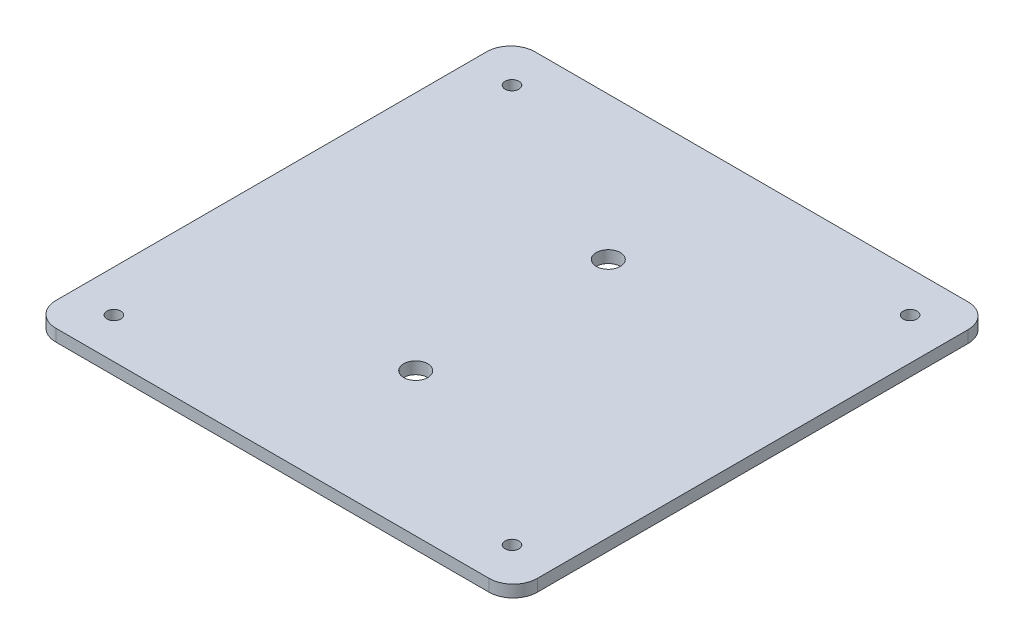
ISO-10303-21;
HEADER;
FILE_DESCRIPTION(('STEP AP214'),'2;1');
FILE_NAME('part.step','',(''),(''),'','','');
FILE_SCHEMA(('AUTOMOTIVE_DESIGN { 1 0 10303 214 1 1 1 1 }'));
ENDSEC;
DATA;
#1=APPLICATION_CONTEXT('core data for automotive mechanical design processes');
#2=APPLICATION_PROTOCOL_DEFINITION('international standard','automotive_design',2000,#1);
#3=PRODUCT_CONTEXT('',#1,'mechanical');
#4=PRODUCT('Part','Part','',(#3));
#5=PRODUCT_RELATED_PRODUCT_CATEGORY('part','',(#4));
#6=PRODUCT_DEFINITION_FORMATION('','',#4);
#7=PRODUCT_DEFINITION_CONTEXT('part definition',#1,'design');
#8=PRODUCT_DEFINITION('design','',#6,#7);
#9=PRODUCT_DEFINITION_SHAPE('','',#8);
#10=(LENGTH_UNIT() NAMED_UNIT(*) SI_UNIT(.MILLI.,.METRE.));
#11=(NAMED_UNIT(*) PLANE_ANGLE_UNIT() SI_UNIT($,.RADIAN.));
#12=(NAMED_UNIT(*) SI_UNIT($,.STERADIAN.) SOLID_ANGLE_UNIT());
#13=UNCERTAINTY_MEASURE_WITH_UNIT(LENGTH_MEASURE(1.E-05),#10,'distance_accuracy_value','');
#14=(GEOMETRIC_REPRESENTATION_CONTEXT(3) GLOBAL_UNCERTAINTY_ASSIGNED_CONTEXT((#13)) GLOBAL_UNIT_ASSIGNED_CONTEXT((#10,
#11,#12)) REPRESENTATION_CONTEXT('',''));
#15=CARTESIAN_POINT('',(0.,0.,0.));
#16=DIRECTION('',(0.,0.,1.));
#17=DIRECTION('',(1.,0.,0.));
#18=AXIS2_PLACEMENT_3D('',#15,#16,#17);
#19=CARTESIAN_POINT('',(0.,3.175,0.));
#20=DIRECTION('',(0.,1.,0.));
#21=DIRECTION('',(0.,0.,1.));
#22=AXIS2_PLACEMENT_3D('',#19,#20,#21);
#23=PLANE('',#22);
#24=CARTESIAN_POINT('',(0.,3.175,-25.4));
#25=DIRECTION('',(0.,1.,0.));
#26=DIRECTION('',(0.,0.,1.));
#27=AXIS2_PLACEMENT_3D('',#24,#25,#26);
#28=CIRCLE('',#27,3.175);
#29=CARTESIAN_POINT('',(0.,3.175,-22.225));
#30=VERTEX_POINT('',#29);
#31=EDGE_CURVE('E237',#30,#30,#28,.T.);
#32=ORIENTED_EDGE('',*,*,#31,.F.);
#33=EDGE_LOOP('',(#32));
#34=FACE_BOUND('',#33,.T.);
#35=CARTESIAN_POINT('',(52.5145,3.175,52.5145));
#36=DIRECTION('',(0.,1.,0.));
#37=DIRECTION('',(0.,0.,1.));
#38=AXIS2_PLACEMENT_3D('',#35,#36,#37);
#39=CIRCLE('',#38,1.8288);
#40=CARTESIAN_POINT('',(52.5145,3.175,54.3433));
#41=VERTEX_POINT('',#40);
#42=EDGE_CURVE('E221',#41,#41,#39,.T.);
#43=ORIENTED_EDGE('',*,*,#42,.F.);
#44=EDGE_LOOP('',(#43));
#45=FACE_BOUND('',#44,.T.);
#46=CARTESIAN_POINT('',(-52.5145,3.175,-52.5145));
#47=DIRECTION('',(0.,1.,0.));
#48=DIRECTION('',(0.,0.,1.));
#49=AXIS2_PLACEMENT_3D('',#46,#47,#48);
#50=CIRCLE('',#49,1.8288);
#51=CARTESIAN_POINT('',(-52.5145,3.175,-50.6857));
#52=VERTEX_POINT('',#51);
#53=EDGE_CURVE('E208',#52,#52,#50,.T.);
#54=ORIENTED_EDGE('',*,*,#53,.F.);
#55=EDGE_LOOP('',(#54));
#56=FACE_BOUND('',#55,.T.);
#57=DIRECTION('',(-1.,0.,0.));
#58=VECTOR('',#57,1.);
#59=CARTESIAN_POINT('',(-63.5,3.175,-63.1798159793815));
#60=LINE('',#59,#58);
#61=CARTESIAN_POINT('',(57.15,3.175,-63.1798159793815));
#62=VERTEX_POINT('',#61);
#63=CARTESIAN_POINT('',(-57.15,3.175,-63.1798159793815));
#64=VERTEX_POINT('',#63);
#65=EDGE_CURVE('E195',#62,#64,#60,.T.);
#66=ORIENTED_EDGE('',*,*,#65,.T.);
#67=CARTESIAN_POINT('',(-57.15,3.175,-56.8298159793815));
#68=DIRECTION('',(0.,1.,0.));
#69=DIRECTION('',(0.,0.,1.));
#70=AXIS2_PLACEMENT_3D('',#67,#68,#69);
#71=CIRCLE('',#70,6.35);
#72=CARTESIAN_POINT('',(-63.5,3.175,-56.8298159793815));
#73=VERTEX_POINT('',#72);
#74=EDGE_CURVE('E168',#64,#73,#71,.T.);
#75=ORIENTED_EDGE('',*,*,#74,.T.);
#76=DIRECTION('',(0.,0.,1.));
#77=VECTOR('',#76,1.);
#78=CARTESIAN_POINT('',(-63.5,3.175,-63.1798159793815));
#79=LINE('',#78,#77);
#80=CARTESIAN_POINT('',(-63.5,3.175,56.8298159793815));
#81=VERTEX_POINT('',#80);
#82=EDGE_CURVE('E125',#73,#81,#79,.T.);
#83=ORIENTED_EDGE('',*,*,#82,.T.);
#84=CARTESIAN_POINT('',(-57.15,3.175,56.8298159793815));
#85=DIRECTION('',(0.,1.,0.));
#86=DIRECTION('',(0.,0.,1.));
#87=AXIS2_PLACEMENT_3D('',#84,#85,#86);
#88=CIRCLE('',#87,6.35);
#89=CARTESIAN_POINT('',(-57.15,3.175,63.1798159793815));
#90=VERTEX_POINT('',#89);
#91=EDGE_CURVE('E60',#81,#90,#88,.T.);
#92=ORIENTED_EDGE('',*,*,#91,.T.);
#93=DIRECTION('',(1.,0.,0.));
#94=VECTOR('',#93,1.);
#95=CARTESIAN_POINT('',(-63.5,3.175,63.1798159793815));
#96=LINE('',#95,#94);
#97=CARTESIAN_POINT('',(57.15,3.175,63.1798159793815));
#98=VERTEX_POINT('',#97);
#99=EDGE_CURVE('E146',#90,#98,#96,.T.);
#100=ORIENTED_EDGE('',*,*,#99,.T.);
#101=CARTESIAN_POINT('',(57.15,3.175,56.8298159793815));
#102=DIRECTION('',(0.,1.,0.));
#103=DIRECTION('',(0.,0.,1.));
#104=AXIS2_PLACEMENT_3D('',#101,#102,#103);
#105=CIRCLE('',#104,6.35);
#106=CARTESIAN_POINT('',(63.5,3.175,56.8298159793815));
#107=VERTEX_POINT('',#106);
#108=EDGE_CURVE('E162',#98,#107,#105,.T.);
#109=ORIENTED_EDGE('',*,*,#108,.T.);
#110=DIRECTION('',(0.,0.,-1.));
#111=VECTOR('',#110,1.);
#112=CARTESIAN_POINT('',(63.5,3.175,-63.1798159793815));
#113=LINE('',#112,#111);
#114=CARTESIAN_POINT('',(63.5,3.175,-56.8298159793815));
#115=VERTEX_POINT('',#114);
#116=EDGE_CURVE('E139',#107,#115,#113,.T.);
#117=ORIENTED_EDGE('',*,*,#116,.T.);
#118=CARTESIAN_POINT('',(57.15,3.175,-56.8298159793815));
#119=DIRECTION('',(0.,1.,0.));
#120=DIRECTION('',(0.,0.,1.));
#121=AXIS2_PLACEMENT_3D('',#118,#119,#120);
#122=CIRCLE('',#121,6.35);
#123=EDGE_CURVE('E165',#115,#62,#122,.T.);
#124=ORIENTED_EDGE('',*,*,#123,.T.);
#125=EDGE_LOOP('',(#66,#75,#83,#92,#100,#109,#117,#124));
#126=FACE_BOUND('',#125,.T.);
#127=CARTESIAN_POINT('',(52.5145,3.175,-52.5145));
#128=DIRECTION('',(0.,1.,0.));
#129=DIRECTION('',(0.,0.,1.));
#130=AXIS2_PLACEMENT_3D('',#127,#128,#129);
#131=CIRCLE('',#130,1.8288);
#132=CARTESIAN_POINT('',(52.5145,3.175,-50.6857));
#133=VERTEX_POINT('',#132);
#134=EDGE_CURVE('E215',#133,#133,#131,.T.);
#135=ORIENTED_EDGE('',*,*,#134,.F.);
#136=EDGE_LOOP('',(#135));
#137=FACE_BOUND('',#136,.T.);
#138=CARTESIAN_POINT('',(-52.5145,3.175,52.5145));
#139=DIRECTION('',(0.,1.,0.));
#140=DIRECTION('',(0.,0.,1.));
#141=AXIS2_PLACEMENT_3D('',#138,#139,#140);
#142=CIRCLE('',#141,1.8288);
#143=CARTESIAN_POINT('',(-52.5145,3.175,54.3433));
#144=VERTEX_POINT('',#143);
#145=EDGE_CURVE('E229',#144,#144,#142,.T.);
#146=ORIENTED_EDGE('',*,*,#145,.F.);
#147=EDGE_LOOP('',(#146));
#148=FACE_BOUND('',#147,.T.);
#149=CARTESIAN_POINT('',(0.,3.175,25.4));
#150=DIRECTION('',(0.,1.,0.));
#151=DIRECTION('',(0.,0.,1.));
#152=AXIS2_PLACEMENT_3D('',#149,#150,#151);
#153=CIRCLE('',#152,3.175);
#154=CARTESIAN_POINT('',(0.,3.175,28.575));
#155=VERTEX_POINT('',#154);
#156=EDGE_CURVE('E245',#155,#155,#153,.T.);
#157=ORIENTED_EDGE('',*,*,#156,.F.);
#158=EDGE_LOOP('',(#157));
#159=FACE_BOUND('',#158,.T.);
#160=ADVANCED_FACE('F39',(#34,#45,#56,#126,#137,#148,#159),#23,.T.);
#161=CARTESIAN_POINT('',(0.,0.,0.));
#162=DIRECTION('',(0.,1.,0.));
#163=DIRECTION('',(0.,0.,1.));
#164=AXIS2_PLACEMENT_3D('',#161,#162,#163);
#165=PLANE('',#164);
#166=DIRECTION('',(0.,0.,1.));
#167=VECTOR('',#166,1.);
#168=CARTESIAN_POINT('',(-63.5,0.,-63.1798159793815));
#169=LINE('',#168,#167);
#170=CARTESIAN_POINT('',(-63.5,0.,-56.8298159793815));
#171=VERTEX_POINT('',#170);
#172=CARTESIAN_POINT('',(-63.5,0.,56.8298159793815));
#173=VERTEX_POINT('',#172);
#174=EDGE_CURVE('E123',#171,#173,#169,.T.);
#175=ORIENTED_EDGE('',*,*,#174,.F.);
#176=CARTESIAN_POINT('',(-57.15,0.,-56.8298159793815));
#177=DIRECTION('',(0.,1.,0.));
#178=DIRECTION('',(0.,0.,1.));
#179=AXIS2_PLACEMENT_3D('',#176,#177,#178);
#180=CIRCLE('',#179,6.35);
#181=CARTESIAN_POINT('',(-57.15,0.,-63.1798159793815));
#182=VERTEX_POINT('',#181);
#183=EDGE_CURVE('E105',#171,#182,#180,.F.);
#184=ORIENTED_EDGE('',*,*,#183,.T.);
#185=DIRECTION('',(-1.,0.,0.));
#186=VECTOR('',#185,1.);
#187=CARTESIAN_POINT('',(-63.5,0.,-63.1798159793815));
#188=LINE('',#187,#186);
#189=CARTESIAN_POINT('',(57.15,0.,-63.1798159793815));
#190=VERTEX_POINT('',#189);
#191=EDGE_CURVE('E135',#190,#182,#188,.T.);
#192=ORIENTED_EDGE('',*,*,#191,.F.);
#193=CARTESIAN_POINT('',(57.15,0.,-56.8298159793815));
#194=DIRECTION('',(0.,1.,0.));
#195=DIRECTION('',(0.,0.,1.));
#196=AXIS2_PLACEMENT_3D('',#193,#194,#195);
#197=CIRCLE('',#196,6.35);
#198=CARTESIAN_POINT('',(63.5,0.,-56.8298159793815));
#199=VERTEX_POINT('',#198);
#200=EDGE_CURVE('E117',#190,#199,#197,.F.);
#201=ORIENTED_EDGE('',*,*,#200,.T.);
#202=DIRECTION('',(0.,0.,-1.));
#203=VECTOR('',#202,1.);
#204=CARTESIAN_POINT('',(63.5,0.,-63.1798159793815));
#205=LINE('',#204,#203);
#206=CARTESIAN_POINT('',(63.5,0.,56.8298159793815));
#207=VERTEX_POINT('',#206);
#208=EDGE_CURVE('E141',#207,#199,#205,.T.);
#209=ORIENTED_EDGE('',*,*,#208,.F.);
#210=CARTESIAN_POINT('',(57.15,0.,56.8298159793815));
#211=DIRECTION('',(0.,1.,0.));
#212=DIRECTION('',(0.,0.,1.));
#213=AXIS2_PLACEMENT_3D('',#210,#211,#212);
#214=CIRCLE('',#213,6.35);
#215=CARTESIAN_POINT('',(57.15,0.,63.1798159793815));
#216=VERTEX_POINT('',#215);
#217=EDGE_CURVE('E150',#207,#216,#214,.F.);
#218=ORIENTED_EDGE('',*,*,#217,.T.);
#219=DIRECTION('',(1.,0.,0.));
#220=VECTOR('',#219,1.);
#221=CARTESIAN_POINT('',(-63.5,0.,63.1798159793815));
#222=LINE('',#221,#220);
#223=CARTESIAN_POINT('',(-57.15,0.,63.1798159793815));
#224=VERTEX_POINT('',#223);
#225=EDGE_CURVE('E134',#224,#216,#222,.T.);
#226=ORIENTED_EDGE('',*,*,#225,.F.);
#227=CARTESIAN_POINT('',(-57.15,0.,56.8298159793815));
#228=DIRECTION('',(0.,1.,0.));
#229=DIRECTION('',(0.,0.,1.));
#230=AXIS2_PLACEMENT_3D('',#227,#228,#229);
#231=CIRCLE('',#230,6.35);
#232=EDGE_CURVE('E127',#224,#173,#231,.F.);
#233=ORIENTED_EDGE('',*,*,#232,.T.);
#234=EDGE_LOOP('',(#175,#184,#192,#201,#209,#218,#226,#233));
#235=FACE_BOUND('',#234,.T.);
#236=CARTESIAN_POINT('',(-52.5145,0.,-52.5145));
#237=DIRECTION('',(0.,1.,0.));
#238=DIRECTION('',(0.,0.,1.));
#239=AXIS2_PLACEMENT_3D('',#236,#237,#238);
#240=CIRCLE('',#239,1.8288);
#241=CARTESIAN_POINT('',(-52.5145,0.,-50.6857));
#242=VERTEX_POINT('',#241);
#243=EDGE_CURVE('E201',#242,#242,#240,.T.);
#244=ORIENTED_EDGE('',*,*,#243,.T.);
#245=EDGE_LOOP('',(#244));
#246=FACE_BOUND('',#245,.T.);
#247=CARTESIAN_POINT('',(52.5145,0.,-52.5145));
#248=DIRECTION('',(0.,1.,0.));
#249=DIRECTION('',(0.,0.,1.));
#250=AXIS2_PLACEMENT_3D('',#247,#248,#249);
#251=CIRCLE('',#250,1.8288);
#252=CARTESIAN_POINT('',(52.5145,0.,-50.6857));
#253=VERTEX_POINT('',#252);
#254=EDGE_CURVE('E217',#253,#253,#251,.T.);
#255=ORIENTED_EDGE('',*,*,#254,.T.);
#256=EDGE_LOOP('',(#255));
#257=FACE_BOUND('',#256,.T.);
#258=CARTESIAN_POINT('',(52.5145,0.,52.5145));
#259=DIRECTION('',(0.,1.,0.));
#260=DIRECTION('',(0.,0.,1.));
#261=AXIS2_PLACEMENT_3D('',#258,#259,#260);
#262=CIRCLE('',#261,1.8288);
#263=CARTESIAN_POINT('',(52.5145,0.,54.3433));
#264=VERTEX_POINT('',#263);
#265=EDGE_CURVE('E225',#264,#264,#262,.T.);
#266=ORIENTED_EDGE('',*,*,#265,.T.);
#267=EDGE_LOOP('',(#266));
#268=FACE_BOUND('',#267,.T.);
#269=CARTESIAN_POINT('',(-52.5145,0.,52.5145));
#270=DIRECTION('',(0.,1.,0.));
#271=DIRECTION('',(0.,0.,1.));
#272=AXIS2_PLACEMENT_3D('',#269,#270,#271);
#273=CIRCLE('',#272,1.8288);
#274=CARTESIAN_POINT('',(-52.5145,0.,54.3433));
#275=VERTEX_POINT('',#274);
#276=EDGE_CURVE('E233',#275,#275,#273,.T.);
#277=ORIENTED_EDGE('',*,*,#276,.T.);
#278=EDGE_LOOP('',(#277));
#279=FACE_BOUND('',#278,.T.);
#280=CARTESIAN_POINT('',(0.,0.,-25.4));
#281=DIRECTION('',(0.,1.,0.));
#282=DIRECTION('',(0.,0.,1.));
#283=AXIS2_PLACEMENT_3D('',#280,#281,#282);
#284=CIRCLE('',#283,3.175);
#285=CARTESIAN_POINT('',(0.,0.,-22.225));
#286=VERTEX_POINT('',#285);
#287=EDGE_CURVE('E241',#286,#286,#284,.T.);
#288=ORIENTED_EDGE('',*,*,#287,.T.);
#289=EDGE_LOOP('',(#288));
#290=FACE_BOUND('',#289,.T.);
#291=CARTESIAN_POINT('',(0.,0.,25.4));
#292=DIRECTION('',(0.,1.,0.));
#293=DIRECTION('',(0.,0.,1.));
#294=AXIS2_PLACEMENT_3D('',#291,#292,#293);
#295=CIRCLE('',#294,3.175);
#296=CARTESIAN_POINT('',(0.,0.,28.575));
#297=VERTEX_POINT('',#296);
#298=EDGE_CURVE('E249',#297,#297,#295,.T.);
#299=ORIENTED_EDGE('',*,*,#298,.T.);
#300=EDGE_LOOP('',(#299));
#301=FACE_BOUND('',#300,.T.);
#302=ADVANCED_FACE('F130',(#235,#246,#257,#268,#279,#290,#301),#165,.F.);
#303=CARTESIAN_POINT('',(63.5,3.175,-63.1798159793815));
#304=DIRECTION('',(-1.,0.,0.));
#305=DIRECTION('',(0.,0.,1.));
#306=AXIS2_PLACEMENT_3D('',#303,#304,#305);
#307=PLANE('',#306);
#308=ORIENTED_EDGE('',*,*,#208,.T.);
#309=DIRECTION('',(0.,-1.,0.));
#310=VECTOR('',#309,1.);
#311=CARTESIAN_POINT('',(63.5,3.175,-56.8298159793815));
#312=LINE('',#311,#310);
#313=EDGE_CURVE('E175',#199,#115,#312,.F.);
#314=ORIENTED_EDGE('',*,*,#313,.T.);
#315=ORIENTED_EDGE('',*,*,#116,.F.);
#316=DIRECTION('',(0.,-1.,0.));
#317=VECTOR('',#316,1.);
#318=CARTESIAN_POINT('',(63.5,3.175,56.8298159793815));
#319=LINE('',#318,#317);
#320=EDGE_CURVE('E171',#107,#207,#319,.T.);
#321=ORIENTED_EDGE('',*,*,#320,.T.);
#322=EDGE_LOOP('',(#308,#314,#315,#321));
#323=FACE_BOUND('',#322,.T.);
#324=ADVANCED_FACE('F190',(#323),#307,.F.);
#325=CARTESIAN_POINT('',(-63.5,3.175,-63.1798159793815));
#326=DIRECTION('',(0.,0.,1.));
#327=DIRECTION('',(1.,0.,0.));
#328=AXIS2_PLACEMENT_3D('',#325,#326,#327);
#329=PLANE('',#328);
#330=ORIENTED_EDGE('',*,*,#191,.T.);
#331=DIRECTION('',(0.,-1.,0.));
#332=VECTOR('',#331,1.);
#333=CARTESIAN_POINT('',(-57.15,3.175,-63.1798159793815));
#334=LINE('',#333,#332);
#335=EDGE_CURVE('E110',#182,#64,#334,.F.);
#336=ORIENTED_EDGE('',*,*,#335,.T.);
#337=ORIENTED_EDGE('',*,*,#65,.F.);
#338=DIRECTION('',(0.,-1.,0.));
#339=VECTOR('',#338,1.);
#340=CARTESIAN_POINT('',(57.15,3.175,-63.1798159793815));
#341=LINE('',#340,#339);
#342=EDGE_CURVE('E116',#62,#190,#341,.T.);
#343=ORIENTED_EDGE('',*,*,#342,.T.);
#344=EDGE_LOOP('',(#330,#336,#337,#343));
#345=FACE_BOUND('',#344,.T.);
#346=ADVANCED_FACE('F277',(#345),#329,.F.);
#347=CARTESIAN_POINT('',(-63.5,3.175,-63.1798159793815));
#348=DIRECTION('',(1.,0.,0.));
#349=DIRECTION('',(0.,0.,-1.));
#350=AXIS2_PLACEMENT_3D('',#347,#348,#349);
#351=PLANE('',#350);
#352=ORIENTED_EDGE('',*,*,#82,.F.);
#353=DIRECTION('',(0.,-1.,0.));
#354=VECTOR('',#353,1.);
#355=CARTESIAN_POINT('',(-63.5,3.175,-56.8298159793815));
#356=LINE('',#355,#354);
#357=EDGE_CURVE('E109',#73,#171,#356,.T.);
#358=ORIENTED_EDGE('',*,*,#357,.T.);
#359=ORIENTED_EDGE('',*,*,#174,.T.);
#360=DIRECTION('',(0.,-1.,0.));
#361=VECTOR('',#360,1.);
#362=CARTESIAN_POINT('',(-63.5,3.175,56.8298159793815));
#363=LINE('',#362,#361);
#364=EDGE_CURVE('E128',#173,#81,#363,.F.);
#365=ORIENTED_EDGE('',*,*,#364,.T.);
#366=EDGE_LOOP('',(#352,#358,#359,#365));
#367=FACE_BOUND('',#366,.T.);
#368=ADVANCED_FACE('F122',(#367),#351,.F.);
#369=CARTESIAN_POINT('',(-63.5,3.175,63.1798159793815));
#370=DIRECTION('',(0.,0.,-1.));
#371=DIRECTION('',(-1.,0.,0.));
#372=AXIS2_PLACEMENT_3D('',#369,#370,#371);
#373=PLANE('',#372);
#374=ORIENTED_EDGE('',*,*,#225,.T.);
#375=DIRECTION('',(0.,-1.,0.));
#376=VECTOR('',#375,1.);
#377=CARTESIAN_POINT('',(57.15,3.175,63.1798159793815));
#378=LINE('',#377,#376);
#379=EDGE_CURVE('E11',#216,#98,#378,.F.);
#380=ORIENTED_EDGE('',*,*,#379,.T.);
#381=ORIENTED_EDGE('',*,*,#99,.F.);
#382=DIRECTION('',(0.,-1.,0.));
#383=VECTOR('',#382,1.);
#384=CARTESIAN_POINT('',(-57.15,3.175,63.1798159793815));
#385=LINE('',#384,#383);
#386=EDGE_CURVE('E48',#90,#224,#385,.T.);
#387=ORIENTED_EDGE('',*,*,#386,.T.);
#388=EDGE_LOOP('',(#374,#380,#381,#387));
#389=FACE_BOUND('',#388,.T.);
#390=ADVANCED_FACE('F180',(#389),#373,.F.);
#391=CARTESIAN_POINT('',(-52.5145,3.175,-52.5145));
#392=DIRECTION('',(0.,-1.,0.));
#393=DIRECTION('',(0.,0.,-1.));
#394=AXIS2_PLACEMENT_3D('',#391,#392,#393);
#395=CYLINDRICAL_SURFACE('',#394,1.8288);
#396=ORIENTED_EDGE('',*,*,#53,.T.);
#397=EDGE_LOOP('',(#396));
#398=FACE_BOUND('',#397,.T.);
#399=ORIENTED_EDGE('',*,*,#243,.F.);
#400=EDGE_LOOP('',(#399));
#401=FACE_BOUND('',#400,.T.);
#402=ADVANCED_FACE('F270',(#398,#401),#395,.F.);
#403=CARTESIAN_POINT('',(52.5145,3.175,-52.5145));
#404=DIRECTION('',(0.,-1.,0.));
#405=DIRECTION('',(0.,0.,-1.));
#406=AXIS2_PLACEMENT_3D('',#403,#404,#405);
#407=CYLINDRICAL_SURFACE('',#406,1.8288);
#408=ORIENTED_EDGE('',*,*,#134,.T.);
#409=EDGE_LOOP('',(#408));
#410=FACE_BOUND('',#409,.T.);
#411=ORIENTED_EDGE('',*,*,#254,.F.);
#412=EDGE_LOOP('',(#411));
#413=FACE_BOUND('',#412,.T.);
#414=ADVANCED_FACE('F322',(#410,#413),#407,.F.);
#415=CARTESIAN_POINT('',(52.5145,3.175,52.5145));
#416=DIRECTION('',(0.,-1.,0.));
#417=DIRECTION('',(0.,0.,-1.));
#418=AXIS2_PLACEMENT_3D('',#415,#416,#417);
#419=CYLINDRICAL_SURFACE('',#418,1.8288);
#420=ORIENTED_EDGE('',*,*,#42,.T.);
#421=EDGE_LOOP('',(#420));
#422=FACE_BOUND('',#421,.T.);
#423=ORIENTED_EDGE('',*,*,#265,.F.);
#424=EDGE_LOOP('',(#423));
#425=FACE_BOUND('',#424,.T.);
#426=ADVANCED_FACE('F305',(#422,#425),#419,.F.);
#427=CARTESIAN_POINT('',(-52.5145,3.175,52.5145));
#428=DIRECTION('',(0.,-1.,0.));
#429=DIRECTION('',(0.,0.,-1.));
#430=AXIS2_PLACEMENT_3D('',#427,#428,#429);
#431=CYLINDRICAL_SURFACE('',#430,1.8288);
#432=ORIENTED_EDGE('',*,*,#145,.T.);
#433=EDGE_LOOP('',(#432));
#434=FACE_BOUND('',#433,.T.);
#435=ORIENTED_EDGE('',*,*,#276,.F.);
#436=EDGE_LOOP('',(#435));
#437=FACE_BOUND('',#436,.T.);
#438=ADVANCED_FACE('F301',(#434,#437),#431,.F.);
#439=CARTESIAN_POINT('',(0.,3.175,-25.4));
#440=DIRECTION('',(0.,-1.,0.));
#441=DIRECTION('',(0.,0.,-1.));
#442=AXIS2_PLACEMENT_3D('',#439,#440,#441);
#443=CYLINDRICAL_SURFACE('',#442,3.175);
#444=ORIENTED_EDGE('',*,*,#31,.T.);
#445=EDGE_LOOP('',(#444));
#446=FACE_BOUND('',#445,.T.);
#447=ORIENTED_EDGE('',*,*,#287,.F.);
#448=EDGE_LOOP('',(#447));
#449=FACE_BOUND('',#448,.T.);
#450=ADVANCED_FACE('F304',(#446,#449),#443,.F.);
#451=CARTESIAN_POINT('',(0.,3.175,25.4));
#452=DIRECTION('',(0.,-1.,0.));
#453=DIRECTION('',(0.,0.,-1.));
#454=AXIS2_PLACEMENT_3D('',#451,#452,#453);
#455=CYLINDRICAL_SURFACE('',#454,3.175);
#456=ORIENTED_EDGE('',*,*,#156,.T.);
#457=EDGE_LOOP('',(#456));
#458=FACE_BOUND('',#457,.T.);
#459=ORIENTED_EDGE('',*,*,#298,.F.);
#460=EDGE_LOOP('',(#459));
#461=FACE_BOUND('',#460,.T.);
#462=ADVANCED_FACE('F257',(#458,#461),#455,.F.);
#463=CARTESIAN_POINT('',(-57.15,3.175,-56.8298159793815));
#464=DIRECTION('',(0.,-1.,0.));
#465=DIRECTION('',(0.,0.,-1.));
#466=AXIS2_PLACEMENT_3D('',#463,#464,#465);
#467=CYLINDRICAL_SURFACE('',#466,6.35);
#468=ORIENTED_EDGE('',*,*,#74,.F.);
#469=ORIENTED_EDGE('',*,*,#335,.F.);
#470=ORIENTED_EDGE('',*,*,#183,.F.);
#471=ORIENTED_EDGE('',*,*,#357,.F.);
#472=EDGE_LOOP('',(#468,#469,#470,#471));
#473=FACE_BOUND('',#472,.T.);
#474=ADVANCED_FACE('F108',(#473),#467,.T.);
#475=CARTESIAN_POINT('',(57.15,3.175,-56.8298159793815));
#476=DIRECTION('',(0.,-1.,0.));
#477=DIRECTION('',(0.,0.,-1.));
#478=AXIS2_PLACEMENT_3D('',#475,#476,#477);
#479=CYLINDRICAL_SURFACE('',#478,6.35);
#480=ORIENTED_EDGE('',*,*,#123,.F.);
#481=ORIENTED_EDGE('',*,*,#313,.F.);
#482=ORIENTED_EDGE('',*,*,#200,.F.);
#483=ORIENTED_EDGE('',*,*,#342,.F.);
#484=EDGE_LOOP('',(#480,#481,#482,#483));
#485=FACE_BOUND('',#484,.T.);
#486=ADVANCED_FACE('F285',(#485),#479,.T.);
#487=CARTESIAN_POINT('',(57.15,3.175,56.8298159793815));
#488=DIRECTION('',(0.,-1.,0.));
#489=DIRECTION('',(0.,0.,-1.));
#490=AXIS2_PLACEMENT_3D('',#487,#488,#489);
#491=CYLINDRICAL_SURFACE('',#490,6.35);
#492=ORIENTED_EDGE('',*,*,#108,.F.);
#493=ORIENTED_EDGE('',*,*,#379,.F.);
#494=ORIENTED_EDGE('',*,*,#217,.F.);
#495=ORIENTED_EDGE('',*,*,#320,.F.);
#496=EDGE_LOOP('',(#492,#493,#494,#495));
#497=FACE_BOUND('',#496,.T.);
#498=ADVANCED_FACE('F187',(#497),#491,.T.);
#499=CARTESIAN_POINT('',(-57.15,3.175,56.8298159793815));
#500=DIRECTION('',(0.,-1.,0.));
#501=DIRECTION('',(0.,0.,-1.));
#502=AXIS2_PLACEMENT_3D('',#499,#500,#501);
#503=CYLINDRICAL_SURFACE('',#502,6.35);
#504=ORIENTED_EDGE('',*,*,#91,.F.);
#505=ORIENTED_EDGE('',*,*,#364,.F.);
#506=ORIENTED_EDGE('',*,*,#232,.F.);
#507=ORIENTED_EDGE('',*,*,#386,.F.);
#508=EDGE_LOOP('',(#504,#505,#506,#507));
#509=FACE_BOUND('',#508,.T.);
#510=ADVANCED_FACE('F41',(#509),#503,.T.);
#511=CLOSED_SHELL('',(#160,#302,#324,#346,#368,#390,#402,#414,#426,#438,#450,#462,#474,#486,
#498,#510));
#512=MANIFOLD_SOLID_BREP('B2',#511);
#513=ADVANCED_BREP_SHAPE_REPRESENTATION('',(#18,#512),#14);
#514=SHAPE_DEFINITION_REPRESENTATION(#9,#513);
ENDSEC;
END-ISO-10303-21;
